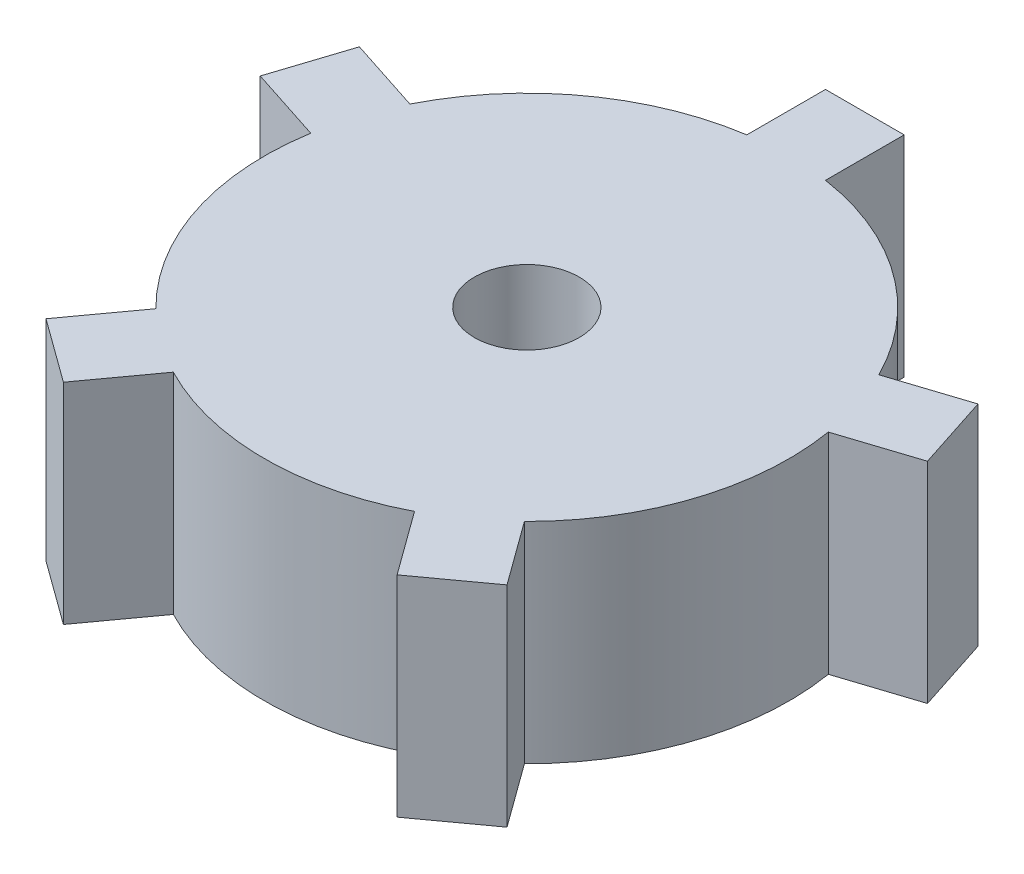
ISO-10303-21;
HEADER;
FILE_DESCRIPTION(('STEP AP214'),'2;1');
FILE_NAME('part.step','',(''),(''),'','','');
FILE_SCHEMA(('AUTOMOTIVE_DESIGN { 1 0 10303 214 1 1 1 1 }'));
ENDSEC;
DATA;
#1=APPLICATION_CONTEXT('core data for automotive mechanical design processes');
#2=APPLICATION_PROTOCOL_DEFINITION('international standard','automotive_design',2000,#1);
#3=PRODUCT_CONTEXT('',#1,'mechanical');
#4=PRODUCT('Part','Part','',(#3));
#5=PRODUCT_RELATED_PRODUCT_CATEGORY('part','',(#4));
#6=PRODUCT_DEFINITION_FORMATION('','',#4);
#7=PRODUCT_DEFINITION_CONTEXT('part definition',#1,'design');
#8=PRODUCT_DEFINITION('design','',#6,#7);
#9=PRODUCT_DEFINITION_SHAPE('','',#8);
#10=(LENGTH_UNIT() NAMED_UNIT(*) SI_UNIT(.MILLI.,.METRE.));
#11=(NAMED_UNIT(*) PLANE_ANGLE_UNIT() SI_UNIT($,.RADIAN.));
#12=(NAMED_UNIT(*) SI_UNIT($,.STERADIAN.) SOLID_ANGLE_UNIT());
#13=UNCERTAINTY_MEASURE_WITH_UNIT(LENGTH_MEASURE(1.E-05),#10,'distance_accuracy_value','');
#14=(GEOMETRIC_REPRESENTATION_CONTEXT(3) GLOBAL_UNCERTAINTY_ASSIGNED_CONTEXT((#13)) GLOBAL_UNIT_ASSIGNED_CONTEXT((#10,
#11,#12)) REPRESENTATION_CONTEXT('',''));
#15=CARTESIAN_POINT('',(0.,0.,0.));
#16=DIRECTION('',(0.,0.,1.));
#17=DIRECTION('',(1.,0.,0.));
#18=AXIS2_PLACEMENT_3D('',#15,#16,#17);
#19=CARTESIAN_POINT('',(0.,20.,0.));
#20=DIRECTION('',(0.,1.,0.));
#21=DIRECTION('',(0.,0.,1.));
#22=AXIS2_PLACEMENT_3D('',#19,#20,#21);
#23=PLANE('',#22);
#24=CARTESIAN_POINT('',(0.,20.,0.));
#25=DIRECTION('',(0.,1.,0.));
#26=DIRECTION('',(0.,0.,1.));
#27=AXIS2_PLACEMENT_3D('',#24,#25,#26);
#28=CIRCLE('',#27,25.);
#29=CARTESIAN_POINT('',(-3.75,20.,-24.7171499166065));
#30=VERTEX_POINT('',#29);
#31=CARTESIAN_POINT('',(-22.3485927635268,20.,-11.2044813128515));
#32=VERTEX_POINT('',#31);
#33=EDGE_CURVE('E242',#30,#32,#28,.T.);
#34=ORIENTED_EDGE('',*,*,#33,.T.);
#35=DIRECTION('',(-0.951056516295154,0.,-0.309016994374947));
#36=VECTOR('',#35,1.);
#37=CARTESIAN_POINT('',(-22.3485927635268,20.,-11.2044813128515));
#38=LINE('',#37,#36);
#39=CARTESIAN_POINT('',(-29.4815166357404,20.,-13.5221087706636));
#40=VERTEX_POINT('',#39);
#41=EDGE_CURVE('E130',#32,#40,#38,.T.);
#42=ORIENTED_EDGE('',*,*,#41,.T.);
#43=DIRECTION('',(-0.309016994374947,0.,0.951056516295154));
#44=VECTOR('',#43,1.);
#45=CARTESIAN_POINT('',(-31.7991440935525,20.,-6.38918489844999));
#46=LINE('',#45,#44);
#47=CARTESIAN_POINT('',(-31.7991440935525,20.,-6.38918489844999));
#48=VERTEX_POINT('',#47);
#49=EDGE_CURVE('E293',#40,#48,#46,.T.);
#50=ORIENTED_EDGE('',*,*,#49,.T.);
#51=DIRECTION('',(0.951056516295154,0.,0.309016994374947));
#52=VECTOR('',#51,1.);
#53=CARTESIAN_POINT('',(-24.6662202213389,20.,-4.07155744063789));
#54=LINE('',#53,#52);
#55=CARTESIAN_POINT('',(-24.6662202213389,20.,-4.07155744063789));
#56=VERTEX_POINT('',#55);
#57=EDGE_CURVE('E312',#48,#56,#54,.T.);
#58=ORIENTED_EDGE('',*,*,#57,.T.);
#59=CARTESIAN_POINT('',(0.,20.,0.));
#60=DIRECTION('',(0.,1.,0.));
#61=DIRECTION('',(0.,0.,1.));
#62=AXIS2_PLACEMENT_3D('',#59,#60,#61);
#63=CIRCLE('',#62,25.);
#64=CARTESIAN_POINT('',(-17.5621899285895,20.,17.7923996389512));
#65=VERTEX_POINT('',#64);
#66=EDGE_CURVE('E309',#56,#65,#63,.T.);
#67=ORIENTED_EDGE('',*,*,#66,.T.);
#68=DIRECTION('',(-0.587785252292473,0.,0.809016994374947));
#69=VECTOR('',#68,1.);
#70=CARTESIAN_POINT('',(-17.5621899285895,20.,17.7923996389512));
#71=LINE('',#70,#69);
#72=CARTESIAN_POINT('',(-21.970579320783,20.,23.8600270967633));
#73=VERTEX_POINT('',#72);
#74=EDGE_CURVE('E311',#65,#73,#71,.T.);
#75=ORIENTED_EDGE('',*,*,#74,.T.);
#76=DIRECTION('',(0.809016994374948,0.,0.587785252292473));
#77=VECTOR('',#76,1.);
#78=CARTESIAN_POINT('',(-15.9029518629709,20.,28.2684164889568));
#79=LINE('',#78,#77);
#80=CARTESIAN_POINT('',(-15.9029518629709,20.,28.2684164889568));
#81=VERTEX_POINT('',#80);
#82=EDGE_CURVE('E314',#73,#81,#79,.T.);
#83=ORIENTED_EDGE('',*,*,#82,.T.);
#84=DIRECTION('',(0.587785252292473,0.,-0.809016994374947));
#85=VECTOR('',#84,1.);
#86=CARTESIAN_POINT('',(-11.4945624707774,20.,22.2007890311447));
#87=LINE('',#86,#85);
#88=CARTESIAN_POINT('',(-11.4945624707774,20.,22.2007890311447));
#89=VERTEX_POINT('',#88);
#90=EDGE_CURVE('E320',#81,#89,#87,.T.);
#91=ORIENTED_EDGE('',*,*,#90,.T.);
#92=CARTESIAN_POINT('',(0.,20.,0.));
#93=DIRECTION('',(0.,1.,0.));
#94=DIRECTION('',(0.,0.,1.));
#95=AXIS2_PLACEMENT_3D('',#92,#93,#94);
#96=CIRCLE('',#95,25.);
#97=CARTESIAN_POINT('',(11.4945624707774,20.,22.2007890311447));
#98=VERTEX_POINT('',#97);
#99=EDGE_CURVE('E322',#89,#98,#96,.T.);
#100=ORIENTED_EDGE('',*,*,#99,.T.);
#101=DIRECTION('',(0.587785252292473,0.,0.809016994374947));
#102=VECTOR('',#101,1.);
#103=CARTESIAN_POINT('',(11.4945624707774,20.,22.2007890311447));
#104=LINE('',#103,#102);
#105=CARTESIAN_POINT('',(15.9029518629709,20.,28.2684164889568));
#106=VERTEX_POINT('',#105);
#107=EDGE_CURVE('E324',#98,#106,#104,.T.);
#108=ORIENTED_EDGE('',*,*,#107,.T.);
#109=DIRECTION('',(0.809016994374948,0.,-0.587785252292473));
#110=VECTOR('',#109,1.);
#111=CARTESIAN_POINT('',(21.970579320783,20.,23.8600270967633));
#112=LINE('',#111,#110);
#113=CARTESIAN_POINT('',(21.970579320783,20.,23.8600270967633));
#114=VERTEX_POINT('',#113);
#115=EDGE_CURVE('E326',#106,#114,#112,.T.);
#116=ORIENTED_EDGE('',*,*,#115,.T.);
#117=DIRECTION('',(-0.587785252292473,0.,-0.809016994374947));
#118=VECTOR('',#117,1.);
#119=CARTESIAN_POINT('',(17.5621899285895,20.,17.7923996389512));
#120=LINE('',#119,#118);
#121=CARTESIAN_POINT('',(17.5621899285895,20.,17.7923996389512));
#122=VERTEX_POINT('',#121);
#123=EDGE_CURVE('E328',#114,#122,#120,.T.);
#124=ORIENTED_EDGE('',*,*,#123,.T.);
#125=CARTESIAN_POINT('',(0.,20.,0.));
#126=DIRECTION('',(0.,1.,0.));
#127=DIRECTION('',(0.,0.,1.));
#128=AXIS2_PLACEMENT_3D('',#125,#126,#127);
#129=CIRCLE('',#128,25.);
#130=CARTESIAN_POINT('',(24.6662202213389,20.,-4.07155744063789));
#131=VERTEX_POINT('',#130);
#132=EDGE_CURVE('E330',#122,#131,#129,.T.);
#133=ORIENTED_EDGE('',*,*,#132,.T.);
#134=DIRECTION('',(0.951056516295154,0.,-0.309016994374947));
#135=VECTOR('',#134,1.);
#136=CARTESIAN_POINT('',(24.6662202213389,20.,-4.07155744063789));
#137=LINE('',#136,#135);
#138=CARTESIAN_POINT('',(31.7991440935525,20.,-6.38918489845));
#139=VERTEX_POINT('',#138);
#140=EDGE_CURVE('E332',#131,#139,#137,.T.);
#141=ORIENTED_EDGE('',*,*,#140,.T.);
#142=DIRECTION('',(-0.309016994374948,0.,-0.951056516295154));
#143=VECTOR('',#142,1.);
#144=CARTESIAN_POINT('',(29.4815166357404,20.,-13.5221087706637));
#145=LINE('',#144,#143);
#146=CARTESIAN_POINT('',(29.4815166357404,20.,-13.5221087706637));
#147=VERTEX_POINT('',#146);
#148=EDGE_CURVE('E334',#139,#147,#145,.T.);
#149=ORIENTED_EDGE('',*,*,#148,.T.);
#150=DIRECTION('',(-0.951056516295154,0.,0.309016994374948));
#151=VECTOR('',#150,1.);
#152=CARTESIAN_POINT('',(22.3485927635268,20.,-11.2044813128515));
#153=LINE('',#152,#151);
#154=CARTESIAN_POINT('',(22.3485927635268,20.,-11.2044813128515));
#155=VERTEX_POINT('',#154);
#156=EDGE_CURVE('E336',#147,#155,#153,.T.);
#157=ORIENTED_EDGE('',*,*,#156,.T.);
#158=CARTESIAN_POINT('',(0.,20.,0.));
#159=DIRECTION('',(0.,1.,0.));
#160=DIRECTION('',(0.,0.,1.));
#161=AXIS2_PLACEMENT_3D('',#158,#159,#160);
#162=CIRCLE('',#161,25.);
#163=CARTESIAN_POINT('',(3.75,20.,-24.7171499166065));
#164=VERTEX_POINT('',#163);
#165=EDGE_CURVE('E185',#155,#164,#162,.T.);
#166=ORIENTED_EDGE('',*,*,#165,.T.);
#167=DIRECTION('',(0.,0.,-1.));
#168=VECTOR('',#167,1.);
#169=CARTESIAN_POINT('',(3.75,20.,-24.7171499166065));
#170=LINE('',#169,#168);
#171=CARTESIAN_POINT('',(3.75,20.,-32.2171499166065));
#172=VERTEX_POINT('',#171);
#173=EDGE_CURVE('E179',#164,#172,#170,.T.);
#174=ORIENTED_EDGE('',*,*,#173,.T.);
#175=DIRECTION('',(-1.,0.,0.));
#176=VECTOR('',#175,1.);
#177=CARTESIAN_POINT('',(-3.75,20.,-32.2171499166065));
#178=LINE('',#177,#176);
#179=CARTESIAN_POINT('',(-3.75,20.,-32.2171499166065));
#180=VERTEX_POINT('',#179);
#181=EDGE_CURVE('E183',#172,#180,#178,.T.);
#182=ORIENTED_EDGE('',*,*,#181,.T.);
#183=DIRECTION('',(0.,0.,1.));
#184=VECTOR('',#183,1.);
#185=CARTESIAN_POINT('',(-3.75,20.,-24.7171499166065));
#186=LINE('',#185,#184);
#187=EDGE_CURVE('E51',#180,#30,#186,.T.);
#188=ORIENTED_EDGE('',*,*,#187,.T.);
#189=EDGE_LOOP('',(#34,#42,#50,#58,#67,#75,#83,#91,#100,#108,#116,#124,#133,#141,#149,#157,#166,
#174,#182,#188));
#190=FACE_BOUND('',#189,.T.);
#191=CARTESIAN_POINT('',(0.,20.,0.));
#192=DIRECTION('',(0.,1.,0.));
#193=DIRECTION('',(0.,0.,1.));
#194=AXIS2_PLACEMENT_3D('',#191,#192,#193);
#195=CIRCLE('',#194,5.);
#196=CARTESIAN_POINT('',(0.,20.,5.));
#197=VERTEX_POINT('',#196);
#198=EDGE_CURVE('E207',#197,#197,#195,.T.);
#199=ORIENTED_EDGE('',*,*,#198,.F.);
#200=EDGE_LOOP('',(#199));
#201=FACE_BOUND('',#200,.T.);
#202=ADVANCED_FACE('F34',(#190,#201),#23,.T.);
#203=CARTESIAN_POINT('',(0.,0.,0.));
#204=DIRECTION('',(0.,1.,0.));
#205=DIRECTION('',(0.,0.,1.));
#206=AXIS2_PLACEMENT_3D('',#203,#204,#205);
#207=PLANE('',#206);
#208=CARTESIAN_POINT('',(0.,0.,0.));
#209=DIRECTION('',(0.,1.,0.));
#210=DIRECTION('',(0.,0.,1.));
#211=AXIS2_PLACEMENT_3D('',#208,#209,#210);
#212=CIRCLE('',#211,25.);
#213=CARTESIAN_POINT('',(-3.75,0.,-24.7171499166065));
#214=VERTEX_POINT('',#213);
#215=CARTESIAN_POINT('',(-22.3485927635268,0.,-11.2044813128515));
#216=VERTEX_POINT('',#215);
#217=EDGE_CURVE('E203',#214,#216,#212,.T.);
#218=ORIENTED_EDGE('',*,*,#217,.F.);
#219=DIRECTION('',(0.,0.,1.));
#220=VECTOR('',#219,1.);
#221=CARTESIAN_POINT('',(-3.75,0.,-24.7171499166065));
#222=LINE('',#221,#220);
#223=CARTESIAN_POINT('',(-3.75,0.,-32.2171499166065));
#224=VERTEX_POINT('',#223);
#225=EDGE_CURVE('E122',#224,#214,#222,.T.);
#226=ORIENTED_EDGE('',*,*,#225,.F.);
#227=DIRECTION('',(-1.,0.,0.));
#228=VECTOR('',#227,1.);
#229=CARTESIAN_POINT('',(-3.75,0.,-32.2171499166065));
#230=LINE('',#229,#228);
#231=CARTESIAN_POINT('',(3.75,0.,-32.2171499166065));
#232=VERTEX_POINT('',#231);
#233=EDGE_CURVE('E116',#232,#224,#230,.T.);
#234=ORIENTED_EDGE('',*,*,#233,.F.);
#235=DIRECTION('',(0.,0.,-1.));
#236=VECTOR('',#235,1.);
#237=CARTESIAN_POINT('',(3.75,0.,-24.7171499166065));
#238=LINE('',#237,#236);
#239=CARTESIAN_POINT('',(3.75,0.,-24.7171499166065));
#240=VERTEX_POINT('',#239);
#241=EDGE_CURVE('E193',#240,#232,#238,.T.);
#242=ORIENTED_EDGE('',*,*,#241,.F.);
#243=CARTESIAN_POINT('',(0.,0.,0.));
#244=DIRECTION('',(0.,1.,0.));
#245=DIRECTION('',(0.,0.,1.));
#246=AXIS2_PLACEMENT_3D('',#243,#244,#245);
#247=CIRCLE('',#246,25.);
#248=CARTESIAN_POINT('',(22.3485927635268,0.,-11.2044813128515));
#249=VERTEX_POINT('',#248);
#250=EDGE_CURVE('E237',#249,#240,#247,.T.);
#251=ORIENTED_EDGE('',*,*,#250,.F.);
#252=DIRECTION('',(-0.951056516295154,0.,0.309016994374948));
#253=VECTOR('',#252,1.);
#254=CARTESIAN_POINT('',(22.3485927635268,0.,-11.2044813128515));
#255=LINE('',#254,#253);
#256=CARTESIAN_POINT('',(29.4815166357404,0.,-13.5221087706637));
#257=VERTEX_POINT('',#256);
#258=EDGE_CURVE('E235',#257,#249,#255,.T.);
#259=ORIENTED_EDGE('',*,*,#258,.F.);
#260=DIRECTION('',(-0.309016994374948,0.,-0.951056516295154));
#261=VECTOR('',#260,1.);
#262=CARTESIAN_POINT('',(29.4815166357404,0.,-13.5221087706637));
#263=LINE('',#262,#261);
#264=CARTESIAN_POINT('',(31.7991440935525,0.,-6.38918489845));
#265=VERTEX_POINT('',#264);
#266=EDGE_CURVE('E233',#265,#257,#263,.T.);
#267=ORIENTED_EDGE('',*,*,#266,.F.);
#268=DIRECTION('',(0.951056516295154,0.,-0.309016994374947));
#269=VECTOR('',#268,1.);
#270=CARTESIAN_POINT('',(24.6662202213389,0.,-4.07155744063789));
#271=LINE('',#270,#269);
#272=CARTESIAN_POINT('',(24.6662202213389,0.,-4.07155744063789));
#273=VERTEX_POINT('',#272);
#274=EDGE_CURVE('E231',#273,#265,#271,.T.);
#275=ORIENTED_EDGE('',*,*,#274,.F.);
#276=CARTESIAN_POINT('',(0.,0.,0.));
#277=DIRECTION('',(0.,1.,0.));
#278=DIRECTION('',(0.,0.,1.));
#279=AXIS2_PLACEMENT_3D('',#276,#277,#278);
#280=CIRCLE('',#279,25.);
#281=CARTESIAN_POINT('',(17.5621899285895,0.,17.7923996389512));
#282=VERTEX_POINT('',#281);
#283=EDGE_CURVE('E229',#282,#273,#280,.T.);
#284=ORIENTED_EDGE('',*,*,#283,.F.);
#285=DIRECTION('',(-0.587785252292473,0.,-0.809016994374947));
#286=VECTOR('',#285,1.);
#287=CARTESIAN_POINT('',(17.5621899285895,0.,17.7923996389512));
#288=LINE('',#287,#286);
#289=CARTESIAN_POINT('',(21.970579320783,0.,23.8600270967633));
#290=VERTEX_POINT('',#289);
#291=EDGE_CURVE('E227',#290,#282,#288,.T.);
#292=ORIENTED_EDGE('',*,*,#291,.F.);
#293=DIRECTION('',(0.809016994374948,0.,-0.587785252292473));
#294=VECTOR('',#293,1.);
#295=CARTESIAN_POINT('',(21.970579320783,0.,23.8600270967633));
#296=LINE('',#295,#294);
#297=CARTESIAN_POINT('',(15.9029518629709,0.,28.2684164889568));
#298=VERTEX_POINT('',#297);
#299=EDGE_CURVE('E225',#298,#290,#296,.T.);
#300=ORIENTED_EDGE('',*,*,#299,.F.);
#301=DIRECTION('',(0.587785252292473,0.,0.809016994374947));
#302=VECTOR('',#301,1.);
#303=CARTESIAN_POINT('',(11.4945624707774,0.,22.2007890311447));
#304=LINE('',#303,#302);
#305=CARTESIAN_POINT('',(11.4945624707774,0.,22.2007890311447));
#306=VERTEX_POINT('',#305);
#307=EDGE_CURVE('E223',#306,#298,#304,.T.);
#308=ORIENTED_EDGE('',*,*,#307,.F.);
#309=CARTESIAN_POINT('',(0.,0.,0.));
#310=DIRECTION('',(0.,1.,0.));
#311=DIRECTION('',(0.,0.,1.));
#312=AXIS2_PLACEMENT_3D('',#309,#310,#311);
#313=CIRCLE('',#312,25.);
#314=CARTESIAN_POINT('',(-11.4945624707774,0.,22.2007890311447));
#315=VERTEX_POINT('',#314);
#316=EDGE_CURVE('E221',#315,#306,#313,.T.);
#317=ORIENTED_EDGE('',*,*,#316,.F.);
#318=DIRECTION('',(0.587785252292473,0.,-0.809016994374947));
#319=VECTOR('',#318,1.);
#320=CARTESIAN_POINT('',(-11.4945624707774,0.,22.2007890311447));
#321=LINE('',#320,#319);
#322=CARTESIAN_POINT('',(-15.9029518629709,0.,28.2684164889568));
#323=VERTEX_POINT('',#322);
#324=EDGE_CURVE('E219',#323,#315,#321,.T.);
#325=ORIENTED_EDGE('',*,*,#324,.F.);
#326=DIRECTION('',(0.809016994374948,0.,0.587785252292473));
#327=VECTOR('',#326,1.);
#328=CARTESIAN_POINT('',(-15.9029518629709,0.,28.2684164889568));
#329=LINE('',#328,#327);
#330=CARTESIAN_POINT('',(-21.970579320783,0.,23.8600270967633));
#331=VERTEX_POINT('',#330);
#332=EDGE_CURVE('E217',#331,#323,#329,.T.);
#333=ORIENTED_EDGE('',*,*,#332,.F.);
#334=DIRECTION('',(-0.587785252292473,0.,0.809016994374947));
#335=VECTOR('',#334,1.);
#336=CARTESIAN_POINT('',(-17.5621899285895,0.,17.7923996389512));
#337=LINE('',#336,#335);
#338=CARTESIAN_POINT('',(-17.5621899285895,0.,17.7923996389512));
#339=VERTEX_POINT('',#338);
#340=EDGE_CURVE('E215',#339,#331,#337,.T.);
#341=ORIENTED_EDGE('',*,*,#340,.F.);
#342=CARTESIAN_POINT('',(0.,0.,0.));
#343=DIRECTION('',(0.,1.,0.));
#344=DIRECTION('',(0.,0.,1.));
#345=AXIS2_PLACEMENT_3D('',#342,#343,#344);
#346=CIRCLE('',#345,25.);
#347=CARTESIAN_POINT('',(-24.6662202213389,0.,-4.07155744063789));
#348=VERTEX_POINT('',#347);
#349=EDGE_CURVE('E213',#348,#339,#346,.T.);
#350=ORIENTED_EDGE('',*,*,#349,.F.);
#351=DIRECTION('',(0.951056516295154,0.,0.309016994374947));
#352=VECTOR('',#351,1.);
#353=CARTESIAN_POINT('',(-24.6662202213389,0.,-4.07155744063789));
#354=LINE('',#353,#352);
#355=CARTESIAN_POINT('',(-31.7991440935525,0.,-6.38918489844999));
#356=VERTEX_POINT('',#355);
#357=EDGE_CURVE('E211',#356,#348,#354,.T.);
#358=ORIENTED_EDGE('',*,*,#357,.F.);
#359=DIRECTION('',(-0.309016994374947,0.,0.951056516295154));
#360=VECTOR('',#359,1.);
#361=CARTESIAN_POINT('',(-31.7991440935525,0.,-6.38918489844999));
#362=LINE('',#361,#360);
#363=CARTESIAN_POINT('',(-29.4815166357404,0.,-13.5221087706636));
#364=VERTEX_POINT('',#363);
#365=EDGE_CURVE('E209',#364,#356,#362,.T.);
#366=ORIENTED_EDGE('',*,*,#365,.F.);
#367=DIRECTION('',(-0.951056516295154,0.,-0.309016994374947));
#368=VECTOR('',#367,1.);
#369=CARTESIAN_POINT('',(-22.3485927635268,0.,-11.2044813128515));
#370=LINE('',#369,#368);
#371=EDGE_CURVE('E206',#216,#364,#370,.T.);
#372=ORIENTED_EDGE('',*,*,#371,.F.);
#373=EDGE_LOOP('',(#218,#226,#234,#242,#251,#259,#267,#275,#284,#292,#300,#308,#317,#325,#333,
#341,#350,#358,#366,#372));
#374=FACE_BOUND('',#373,.T.);
#375=CARTESIAN_POINT('',(0.,0.,0.));
#376=DIRECTION('',(0.,1.,0.));
#377=DIRECTION('',(0.,0.,1.));
#378=AXIS2_PLACEMENT_3D('',#375,#376,#377);
#379=CIRCLE('',#378,5.);
#380=CARTESIAN_POINT('',(0.,0.,5.));
#381=VERTEX_POINT('',#380);
#382=EDGE_CURVE('E587',#381,#381,#379,.T.);
#383=ORIENTED_EDGE('',*,*,#382,.T.);
#384=EDGE_LOOP('',(#383));
#385=FACE_BOUND('',#384,.T.);
#386=ADVANCED_FACE('F297',(#374,#385),#207,.F.);
#387=CARTESIAN_POINT('',(0.,20.,0.));
#388=DIRECTION('',(0.,-1.,0.));
#389=DIRECTION('',(0.,0.,-1.));
#390=AXIS2_PLACEMENT_3D('',#387,#388,#389);
#391=CYLINDRICAL_SURFACE('',#390,25.);
#392=ORIENTED_EDGE('',*,*,#217,.T.);
#393=DIRECTION('',(0.,-1.,0.));
#394=VECTOR('',#393,1.);
#395=CARTESIAN_POINT('',(-22.3485927635268,20.,-11.2044813128515));
#396=LINE('',#395,#394);
#397=EDGE_CURVE('E11',#32,#216,#396,.T.);
#398=ORIENTED_EDGE('',*,*,#397,.F.);
#399=ORIENTED_EDGE('',*,*,#33,.F.);
#400=DIRECTION('',(0.,-1.,0.));
#401=VECTOR('',#400,1.);
#402=CARTESIAN_POINT('',(-3.75,20.,-24.7171499166065));
#403=LINE('',#402,#401);
#404=EDGE_CURVE('E199',#30,#214,#403,.T.);
#405=ORIENTED_EDGE('',*,*,#404,.T.);
#406=EDGE_LOOP('',(#392,#398,#399,#405));
#407=FACE_BOUND('',#406,.T.);
#408=ADVANCED_FACE('F36',(#407),#391,.T.);
#409=CARTESIAN_POINT('',(-22.3485927635268,20.,-11.2044813128515));
#410=DIRECTION('',(-0.309016994374947,0.,0.951056516295154));
#411=DIRECTION('',(0.951056516295154,0.,0.309016994374947));
#412=AXIS2_PLACEMENT_3D('',#409,#410,#411);
#413=PLANE('',#412);
#414=ORIENTED_EDGE('',*,*,#371,.T.);
#415=DIRECTION('',(0.,-1.,0.));
#416=VECTOR('',#415,1.);
#417=CARTESIAN_POINT('',(-29.4815166357404,20.,-13.5221087706636));
#418=LINE('',#417,#416);
#419=EDGE_CURVE('E43',#40,#364,#418,.T.);
#420=ORIENTED_EDGE('',*,*,#419,.F.);
#421=ORIENTED_EDGE('',*,*,#41,.F.);
#422=ORIENTED_EDGE('',*,*,#397,.T.);
#423=EDGE_LOOP('',(#414,#420,#421,#422));
#424=FACE_BOUND('',#423,.T.);
#425=ADVANCED_FACE('F370',(#424),#413,.F.);
#426=CARTESIAN_POINT('',(-31.7991440935525,20.,-6.38918489844999));
#427=DIRECTION('',(0.951056516295154,0.,0.309016994374947));
#428=DIRECTION('',(0.309016994374947,0.,-0.951056516295154));
#429=AXIS2_PLACEMENT_3D('',#426,#427,#428);
#430=PLANE('',#429);
#431=ORIENTED_EDGE('',*,*,#365,.T.);
#432=DIRECTION('',(0.,-1.,0.));
#433=VECTOR('',#432,1.);
#434=CARTESIAN_POINT('',(-31.7991440935525,20.,-6.38918489844999));
#435=LINE('',#434,#433);
#436=EDGE_CURVE('E285',#48,#356,#435,.T.);
#437=ORIENTED_EDGE('',*,*,#436,.F.);
#438=ORIENTED_EDGE('',*,*,#49,.F.);
#439=ORIENTED_EDGE('',*,*,#419,.T.);
#440=EDGE_LOOP('',(#431,#437,#438,#439));
#441=FACE_BOUND('',#440,.T.);
#442=ADVANCED_FACE('F291',(#441),#430,.F.);
#443=CARTESIAN_POINT('',(-24.6662202213389,20.,-4.07155744063789));
#444=DIRECTION('',(0.309016994374947,0.,-0.951056516295154));
#445=DIRECTION('',(-0.951056516295154,0.,-0.309016994374947));
#446=AXIS2_PLACEMENT_3D('',#443,#444,#445);
#447=PLANE('',#446);
#448=ORIENTED_EDGE('',*,*,#357,.T.);
#449=DIRECTION('',(0.,-1.,0.));
#450=VECTOR('',#449,1.);
#451=CARTESIAN_POINT('',(-24.6662202213389,20.,-4.07155744063789));
#452=LINE('',#451,#450);
#453=EDGE_CURVE('E282',#56,#348,#452,.T.);
#454=ORIENTED_EDGE('',*,*,#453,.F.);
#455=ORIENTED_EDGE('',*,*,#57,.F.);
#456=ORIENTED_EDGE('',*,*,#436,.T.);
#457=EDGE_LOOP('',(#448,#454,#455,#456));
#458=FACE_BOUND('',#457,.T.);
#459=ADVANCED_FACE('F303',(#458),#447,.F.);
#460=CARTESIAN_POINT('',(0.,20.,0.));
#461=DIRECTION('',(0.,-1.,0.));
#462=DIRECTION('',(0.,0.,-1.));
#463=AXIS2_PLACEMENT_3D('',#460,#461,#462);
#464=CYLINDRICAL_SURFACE('',#463,25.);
#465=ORIENTED_EDGE('',*,*,#349,.T.);
#466=DIRECTION('',(0.,-1.,0.));
#467=VECTOR('',#466,1.);
#468=CARTESIAN_POINT('',(-17.5621899285895,20.,17.7923996389512));
#469=LINE('',#468,#467);
#470=EDGE_CURVE('E279',#65,#339,#469,.T.);
#471=ORIENTED_EDGE('',*,*,#470,.F.);
#472=ORIENTED_EDGE('',*,*,#66,.F.);
#473=ORIENTED_EDGE('',*,*,#453,.T.);
#474=EDGE_LOOP('',(#465,#471,#472,#473));
#475=FACE_BOUND('',#474,.T.);
#476=ADVANCED_FACE('F307',(#475),#464,.T.);
#477=CARTESIAN_POINT('',(-17.5621899285895,20.,17.7923996389512));
#478=DIRECTION('',(0.809016994374947,0.,0.587785252292473));
#479=DIRECTION('',(0.587785252292473,0.,-0.809016994374947));
#480=AXIS2_PLACEMENT_3D('',#477,#478,#479);
#481=PLANE('',#480);
#482=ORIENTED_EDGE('',*,*,#340,.T.);
#483=DIRECTION('',(0.,-1.,0.));
#484=VECTOR('',#483,1.);
#485=CARTESIAN_POINT('',(-21.970579320783,20.,23.8600270967633));
#486=LINE('',#485,#484);
#487=EDGE_CURVE('E276',#73,#331,#486,.T.);
#488=ORIENTED_EDGE('',*,*,#487,.F.);
#489=ORIENTED_EDGE('',*,*,#74,.F.);
#490=ORIENTED_EDGE('',*,*,#470,.T.);
#491=EDGE_LOOP('',(#482,#488,#489,#490));
#492=FACE_BOUND('',#491,.T.);
#493=ADVANCED_FACE('F383',(#492),#481,.F.);
#494=CARTESIAN_POINT('',(-15.9029518629709,20.,28.2684164889568));
#495=DIRECTION('',(0.587785252292473,0.,-0.809016994374948));
#496=DIRECTION('',(-0.809016994374947,0.,-0.587785252292473));
#497=AXIS2_PLACEMENT_3D('',#494,#495,#496);
#498=PLANE('',#497);
#499=ORIENTED_EDGE('',*,*,#332,.T.);
#500=DIRECTION('',(0.,-1.,0.));
#501=VECTOR('',#500,1.);
#502=CARTESIAN_POINT('',(-15.9029518629709,20.,28.2684164889568));
#503=LINE('',#502,#501);
#504=EDGE_CURVE('E273',#81,#323,#503,.T.);
#505=ORIENTED_EDGE('',*,*,#504,.F.);
#506=ORIENTED_EDGE('',*,*,#82,.F.);
#507=ORIENTED_EDGE('',*,*,#487,.T.);
#508=EDGE_LOOP('',(#499,#505,#506,#507));
#509=FACE_BOUND('',#508,.T.);
#510=ADVANCED_FACE('F386',(#509),#498,.F.);
#511=CARTESIAN_POINT('',(-11.4945624707774,20.,22.2007890311447));
#512=DIRECTION('',(-0.809016994374947,0.,-0.587785252292473));
#513=DIRECTION('',(-0.587785252292473,0.,0.809016994374947));
#514=AXIS2_PLACEMENT_3D('',#511,#512,#513);
#515=PLANE('',#514);
#516=ORIENTED_EDGE('',*,*,#324,.T.);
#517=DIRECTION('',(0.,-1.,0.));
#518=VECTOR('',#517,1.);
#519=CARTESIAN_POINT('',(-11.4945624707774,20.,22.2007890311447));
#520=LINE('',#519,#518);
#521=EDGE_CURVE('E270',#89,#315,#520,.T.);
#522=ORIENTED_EDGE('',*,*,#521,.F.);
#523=ORIENTED_EDGE('',*,*,#90,.F.);
#524=ORIENTED_EDGE('',*,*,#504,.T.);
#525=EDGE_LOOP('',(#516,#522,#523,#524));
#526=FACE_BOUND('',#525,.T.);
#527=ADVANCED_FACE('F390',(#526),#515,.F.);
#528=CARTESIAN_POINT('',(0.,20.,0.));
#529=DIRECTION('',(0.,-1.,0.));
#530=DIRECTION('',(0.,0.,-1.));
#531=AXIS2_PLACEMENT_3D('',#528,#529,#530);
#532=CYLINDRICAL_SURFACE('',#531,25.);
#533=ORIENTED_EDGE('',*,*,#316,.T.);
#534=DIRECTION('',(0.,-1.,0.));
#535=VECTOR('',#534,1.);
#536=CARTESIAN_POINT('',(11.4945624707774,20.,22.2007890311447));
#537=LINE('',#536,#535);
#538=EDGE_CURVE('E267',#98,#306,#537,.T.);
#539=ORIENTED_EDGE('',*,*,#538,.F.);
#540=ORIENTED_EDGE('',*,*,#99,.F.);
#541=ORIENTED_EDGE('',*,*,#521,.T.);
#542=EDGE_LOOP('',(#533,#539,#540,#541));
#543=FACE_BOUND('',#542,.T.);
#544=ADVANCED_FACE('F394',(#543),#532,.T.);
#545=CARTESIAN_POINT('',(11.4945624707774,20.,22.2007890311447));
#546=DIRECTION('',(0.809016994374947,0.,-0.587785252292473));
#547=DIRECTION('',(-0.587785252292473,0.,-0.809016994374947));
#548=AXIS2_PLACEMENT_3D('',#545,#546,#547);
#549=PLANE('',#548);
#550=ORIENTED_EDGE('',*,*,#307,.T.);
#551=DIRECTION('',(0.,-1.,0.));
#552=VECTOR('',#551,1.);
#553=CARTESIAN_POINT('',(15.9029518629709,20.,28.2684164889568));
#554=LINE('',#553,#552);
#555=EDGE_CURVE('E264',#106,#298,#554,.T.);
#556=ORIENTED_EDGE('',*,*,#555,.F.);
#557=ORIENTED_EDGE('',*,*,#107,.F.);
#558=ORIENTED_EDGE('',*,*,#538,.T.);
#559=EDGE_LOOP('',(#550,#556,#557,#558));
#560=FACE_BOUND('',#559,.T.);
#561=ADVANCED_FACE('F398',(#560),#549,.F.);
#562=CARTESIAN_POINT('',(21.970579320783,20.,23.8600270967633));
#563=DIRECTION('',(-0.587785252292473,0.,-0.809016994374948));
#564=DIRECTION('',(-0.809016994374947,0.,0.587785252292473));
#565=AXIS2_PLACEMENT_3D('',#562,#563,#564);
#566=PLANE('',#565);
#567=ORIENTED_EDGE('',*,*,#299,.T.);
#568=DIRECTION('',(0.,-1.,0.));
#569=VECTOR('',#568,1.);
#570=CARTESIAN_POINT('',(21.970579320783,20.,23.8600270967633));
#571=LINE('',#570,#569);
#572=EDGE_CURVE('E261',#114,#290,#571,.T.);
#573=ORIENTED_EDGE('',*,*,#572,.F.);
#574=ORIENTED_EDGE('',*,*,#115,.F.);
#575=ORIENTED_EDGE('',*,*,#555,.T.);
#576=EDGE_LOOP('',(#567,#573,#574,#575));
#577=FACE_BOUND('',#576,.T.);
#578=ADVANCED_FACE('F402',(#577),#566,.F.);
#579=CARTESIAN_POINT('',(17.5621899285895,20.,17.7923996389512));
#580=DIRECTION('',(-0.809016994374947,0.,0.587785252292473));
#581=DIRECTION('',(0.587785252292473,0.,0.809016994374948));
#582=AXIS2_PLACEMENT_3D('',#579,#580,#581);
#583=PLANE('',#582);
#584=ORIENTED_EDGE('',*,*,#291,.T.);
#585=DIRECTION('',(0.,-1.,0.));
#586=VECTOR('',#585,1.);
#587=CARTESIAN_POINT('',(17.5621899285895,20.,17.7923996389512));
#588=LINE('',#587,#586);
#589=EDGE_CURVE('E258',#122,#282,#588,.T.);
#590=ORIENTED_EDGE('',*,*,#589,.F.);
#591=ORIENTED_EDGE('',*,*,#123,.F.);
#592=ORIENTED_EDGE('',*,*,#572,.T.);
#593=EDGE_LOOP('',(#584,#590,#591,#592));
#594=FACE_BOUND('',#593,.T.);
#595=ADVANCED_FACE('F406',(#594),#583,.F.);
#596=CARTESIAN_POINT('',(0.,20.,0.));
#597=DIRECTION('',(0.,-1.,0.));
#598=DIRECTION('',(0.,0.,-1.));
#599=AXIS2_PLACEMENT_3D('',#596,#597,#598);
#600=CYLINDRICAL_SURFACE('',#599,25.);
#601=ORIENTED_EDGE('',*,*,#283,.T.);
#602=DIRECTION('',(0.,-1.,0.));
#603=VECTOR('',#602,1.);
#604=CARTESIAN_POINT('',(24.6662202213389,20.,-4.07155744063789));
#605=LINE('',#604,#603);
#606=EDGE_CURVE('E255',#131,#273,#605,.T.);
#607=ORIENTED_EDGE('',*,*,#606,.F.);
#608=ORIENTED_EDGE('',*,*,#132,.F.);
#609=ORIENTED_EDGE('',*,*,#589,.T.);
#610=EDGE_LOOP('',(#601,#607,#608,#609));
#611=FACE_BOUND('',#610,.T.);
#612=ADVANCED_FACE('F410',(#611),#600,.T.);
#613=CARTESIAN_POINT('',(24.6662202213389,20.,-4.07155744063789));
#614=DIRECTION('',(-0.309016994374947,0.,-0.951056516295154));
#615=DIRECTION('',(-0.951056516295154,0.,0.309016994374947));
#616=AXIS2_PLACEMENT_3D('',#613,#614,#615);
#617=PLANE('',#616);
#618=ORIENTED_EDGE('',*,*,#274,.T.);
#619=DIRECTION('',(0.,-1.,0.));
#620=VECTOR('',#619,1.);
#621=CARTESIAN_POINT('',(31.7991440935525,20.,-6.38918489845));
#622=LINE('',#621,#620);
#623=EDGE_CURVE('E252',#139,#265,#622,.T.);
#624=ORIENTED_EDGE('',*,*,#623,.F.);
#625=ORIENTED_EDGE('',*,*,#140,.F.);
#626=ORIENTED_EDGE('',*,*,#606,.T.);
#627=EDGE_LOOP('',(#618,#624,#625,#626));
#628=FACE_BOUND('',#627,.T.);
#629=ADVANCED_FACE('F414',(#628),#617,.F.);
#630=CARTESIAN_POINT('',(29.4815166357404,20.,-13.5221087706637));
#631=DIRECTION('',(-0.951056516295154,0.,0.309016994374948));
#632=DIRECTION('',(0.309016994374948,0.,0.951056516295154));
#633=AXIS2_PLACEMENT_3D('',#630,#631,#632);
#634=PLANE('',#633);
#635=ORIENTED_EDGE('',*,*,#266,.T.);
#636=DIRECTION('',(0.,-1.,0.));
#637=VECTOR('',#636,1.);
#638=CARTESIAN_POINT('',(29.4815166357404,20.,-13.5221087706637));
#639=LINE('',#638,#637);
#640=EDGE_CURVE('E249',#147,#257,#639,.T.);
#641=ORIENTED_EDGE('',*,*,#640,.F.);
#642=ORIENTED_EDGE('',*,*,#148,.F.);
#643=ORIENTED_EDGE('',*,*,#623,.T.);
#644=EDGE_LOOP('',(#635,#641,#642,#643));
#645=FACE_BOUND('',#644,.T.);
#646=ADVANCED_FACE('F418',(#645),#634,.F.);
#647=CARTESIAN_POINT('',(22.3485927635268,20.,-11.2044813128515));
#648=DIRECTION('',(0.309016994374948,0.,0.951056516295154));
#649=DIRECTION('',(0.951056516295154,0.,-0.309016994374948));
#650=AXIS2_PLACEMENT_3D('',#647,#648,#649);
#651=PLANE('',#650);
#652=ORIENTED_EDGE('',*,*,#258,.T.);
#653=DIRECTION('',(0.,-1.,0.));
#654=VECTOR('',#653,1.);
#655=CARTESIAN_POINT('',(22.3485927635268,20.,-11.2044813128515));
#656=LINE('',#655,#654);
#657=EDGE_CURVE('E246',#155,#249,#656,.T.);
#658=ORIENTED_EDGE('',*,*,#657,.F.);
#659=ORIENTED_EDGE('',*,*,#156,.F.);
#660=ORIENTED_EDGE('',*,*,#640,.T.);
#661=EDGE_LOOP('',(#652,#658,#659,#660));
#662=FACE_BOUND('',#661,.T.);
#663=ADVANCED_FACE('F342',(#662),#651,.F.);
#664=CARTESIAN_POINT('',(0.,20.,0.));
#665=DIRECTION('',(0.,-1.,0.));
#666=DIRECTION('',(0.,0.,-1.));
#667=AXIS2_PLACEMENT_3D('',#664,#665,#666);
#668=CYLINDRICAL_SURFACE('',#667,25.);
#669=ORIENTED_EDGE('',*,*,#250,.T.);
#670=DIRECTION('',(0.,-1.,0.));
#671=VECTOR('',#670,1.);
#672=CARTESIAN_POINT('',(3.75,20.,-24.7171499166065));
#673=LINE('',#672,#671);
#674=EDGE_CURVE('E194',#164,#240,#673,.T.);
#675=ORIENTED_EDGE('',*,*,#674,.F.);
#676=ORIENTED_EDGE('',*,*,#165,.F.);
#677=ORIENTED_EDGE('',*,*,#657,.T.);
#678=EDGE_LOOP('',(#669,#675,#676,#677));
#679=FACE_BOUND('',#678,.T.);
#680=ADVANCED_FACE('F346',(#679),#668,.T.);
#681=CARTESIAN_POINT('',(3.75,20.,-24.7171499166065));
#682=DIRECTION('',(-1.,0.,0.));
#683=DIRECTION('',(0.,0.,1.));
#684=AXIS2_PLACEMENT_3D('',#681,#682,#683);
#685=PLANE('',#684);
#686=ORIENTED_EDGE('',*,*,#241,.T.);
#687=DIRECTION('',(0.,-1.,0.));
#688=VECTOR('',#687,1.);
#689=CARTESIAN_POINT('',(3.75,20.,-32.2171499166065));
#690=LINE('',#689,#688);
#691=EDGE_CURVE('E190',#172,#232,#690,.T.);
#692=ORIENTED_EDGE('',*,*,#691,.F.);
#693=ORIENTED_EDGE('',*,*,#173,.F.);
#694=ORIENTED_EDGE('',*,*,#674,.T.);
#695=EDGE_LOOP('',(#686,#692,#693,#694));
#696=FACE_BOUND('',#695,.T.);
#697=ADVANCED_FACE('F191',(#696),#685,.F.);
#698=CARTESIAN_POINT('',(-3.75,20.,-32.2171499166065));
#699=DIRECTION('',(0.,0.,1.));
#700=DIRECTION('',(1.,0.,0.));
#701=AXIS2_PLACEMENT_3D('',#698,#699,#700);
#702=PLANE('',#701);
#703=ORIENTED_EDGE('',*,*,#233,.T.);
#704=DIRECTION('',(0.,-1.,0.));
#705=VECTOR('',#704,1.);
#706=CARTESIAN_POINT('',(-3.75,20.,-32.2171499166065));
#707=LINE('',#706,#705);
#708=EDGE_CURVE('E195',#180,#224,#707,.T.);
#709=ORIENTED_EDGE('',*,*,#708,.F.);
#710=ORIENTED_EDGE('',*,*,#181,.F.);
#711=ORIENTED_EDGE('',*,*,#691,.T.);
#712=EDGE_LOOP('',(#703,#709,#710,#711));
#713=FACE_BOUND('',#712,.T.);
#714=ADVANCED_FACE('F197',(#713),#702,.F.);
#715=CARTESIAN_POINT('',(-3.75,20.,-24.7171499166065));
#716=DIRECTION('',(1.,0.,0.));
#717=DIRECTION('',(0.,0.,-1.));
#718=AXIS2_PLACEMENT_3D('',#715,#716,#717);
#719=PLANE('',#718);
#720=ORIENTED_EDGE('',*,*,#225,.T.);
#721=ORIENTED_EDGE('',*,*,#404,.F.);
#722=ORIENTED_EDGE('',*,*,#187,.F.);
#723=ORIENTED_EDGE('',*,*,#708,.T.);
#724=EDGE_LOOP('',(#720,#721,#722,#723));
#725=FACE_BOUND('',#724,.T.);
#726=ADVANCED_FACE('F350',(#725),#719,.F.);
#727=CARTESIAN_POINT('',(0.,20.,0.));
#728=DIRECTION('',(0.,-1.,0.));
#729=DIRECTION('',(0.,0.,-1.));
#730=AXIS2_PLACEMENT_3D('',#727,#728,#729);
#731=CYLINDRICAL_SURFACE('',#730,5.);
#732=ORIENTED_EDGE('',*,*,#198,.T.);
#733=EDGE_LOOP('',(#732));
#734=FACE_BOUND('',#733,.T.);
#735=ORIENTED_EDGE('',*,*,#382,.F.);
#736=EDGE_LOOP('',(#735));
#737=FACE_BOUND('',#736,.T.);
#738=ADVANCED_FACE('F352',(#734,#737),#731,.F.);
#739=CLOSED_SHELL('',(#202,#386,#408,#425,#442,#459,#476,#493,#510,#527,#544,#561,#578,#595,
#612,#629,#646,#663,#680,#697,#714,#726,#738));
#740=MANIFOLD_SOLID_BREP('B2',#739);
#741=ADVANCED_BREP_SHAPE_REPRESENTATION('',(#18,#740),#14);
#742=SHAPE_DEFINITION_REPRESENTATION(#9,#741);
ENDSEC;
END-ISO-10303-21;
